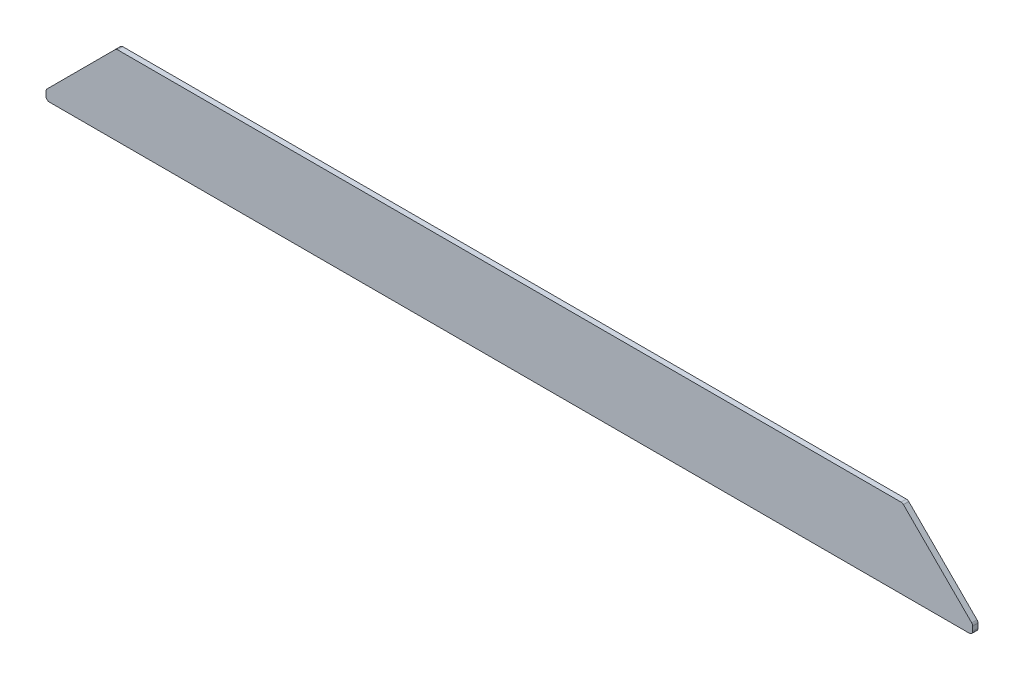
ISO-10303-21;
HEADER;
FILE_DESCRIPTION(('STEP AP214'),'2;1');
FILE_NAME('part.step','',(''),(''),'','','');
FILE_SCHEMA(('AUTOMOTIVE_DESIGN { 1 0 10303 214 1 1 1 1 }'));
ENDSEC;
DATA;
#1=APPLICATION_CONTEXT('core data for automotive mechanical design processes');
#2=APPLICATION_PROTOCOL_DEFINITION('international standard','automotive_design',2000,#1);
#3=PRODUCT_CONTEXT('',#1,'mechanical');
#4=PRODUCT('Part','Part','',(#3));
#5=PRODUCT_RELATED_PRODUCT_CATEGORY('part','',(#4));
#6=PRODUCT_DEFINITION_FORMATION('','',#4);
#7=PRODUCT_DEFINITION_CONTEXT('part definition',#1,'design');
#8=PRODUCT_DEFINITION('design','',#6,#7);
#9=PRODUCT_DEFINITION_SHAPE('','',#8);
#10=(LENGTH_UNIT() NAMED_UNIT(*) SI_UNIT(.MILLI.,.METRE.));
#11=(NAMED_UNIT(*) PLANE_ANGLE_UNIT() SI_UNIT($,.RADIAN.));
#12=(NAMED_UNIT(*) SI_UNIT($,.STERADIAN.) SOLID_ANGLE_UNIT());
#13=UNCERTAINTY_MEASURE_WITH_UNIT(LENGTH_MEASURE(1.E-05),#10,'distance_accuracy_value','');
#14=(GEOMETRIC_REPRESENTATION_CONTEXT(3) GLOBAL_UNCERTAINTY_ASSIGNED_CONTEXT((#13)) GLOBAL_UNIT_ASSIGNED_CONTEXT((#10,
#11,#12)) REPRESENTATION_CONTEXT('',''));
#15=CARTESIAN_POINT('',(0.,0.,0.));
#16=DIRECTION('',(0.,0.,1.));
#17=DIRECTION('',(1.,0.,0.));
#18=AXIS2_PLACEMENT_3D('',#15,#16,#17);
#19=CARTESIAN_POINT('',(280.,0.,1.6));
#20=DIRECTION('',(-1.,0.,0.));
#21=DIRECTION('',(0.,0.,1.));
#22=AXIS2_PLACEMENT_3D('',#19,#20,#21);
#23=PLANE('',#22);
#24=DIRECTION('',(0.,1.,0.));
#25=VECTOR('',#24,1.);
#26=CARTESIAN_POINT('',(280.,0.,1.6));
#27=LINE('',#26,#25);
#28=CARTESIAN_POINT('',(280.,1.,1.6));
#29=VERTEX_POINT('',#28);
#30=CARTESIAN_POINT('',(280.,2.37258300203055,1.6));
#31=VERTEX_POINT('',#30);
#32=EDGE_CURVE('E229',#29,#31,#27,.T.);
#33=ORIENTED_EDGE('',*,*,#32,.F.);
#34=DIRECTION('',(0.,0.,-1.));
#35=VECTOR('',#34,1.);
#36=CARTESIAN_POINT('',(280.,1.,1.6));
#37=LINE('',#36,#35);
#38=CARTESIAN_POINT('',(280.,1.,0.));
#39=VERTEX_POINT('',#38);
#40=EDGE_CURVE('E280',#29,#39,#37,.T.);
#41=ORIENTED_EDGE('',*,*,#40,.T.);
#42=DIRECTION('',(0.,1.,0.));
#43=VECTOR('',#42,1.);
#44=CARTESIAN_POINT('',(280.,0.,0.));
#45=LINE('',#44,#43);
#46=CARTESIAN_POINT('',(280.,2.37258300203055,0.));
#47=VERTEX_POINT('',#46);
#48=EDGE_CURVE('E218',#39,#47,#45,.T.);
#49=ORIENTED_EDGE('',*,*,#48,.T.);
#50=DIRECTION('',(0.,0.,-1.));
#51=VECTOR('',#50,1.);
#52=CARTESIAN_POINT('',(280.,2.37258300203055,1.6));
#53=LINE('',#52,#51);
#54=EDGE_CURVE('E255',#47,#31,#53,.F.);
#55=ORIENTED_EDGE('',*,*,#54,.T.);
#56=EDGE_LOOP('',(#33,#41,#49,#55));
#57=FACE_BOUND('',#56,.T.);
#58=ADVANCED_FACE('F44',(#57),#23,.F.);
#59=CARTESIAN_POINT('',(141.393398282201,141.393398282202,1.6));
#60=DIRECTION('',(-0.707106781186545,-0.70710678118655,0.));
#61=DIRECTION('',(0.70710678118655,-0.707106781186545,0.));
#62=AXIS2_PLACEMENT_3D('',#59,#60,#61);
#63=PLANE('',#62);
#64=DIRECTION('',(-0.70710678118655,0.707106781186545,0.));
#65=VECTOR('',#64,1.);
#66=CARTESIAN_POINT('',(141.393398282201,141.393398282202,0.));
#67=LINE('',#66,#65);
#68=CARTESIAN_POINT('',(279.707106781187,3.0796897832171,0.));
#69=VERTEX_POINT('',#68);
#70=CARTESIAN_POINT('',(259.079689783217,23.7071067811865,0.));
#71=VERTEX_POINT('',#70);
#72=EDGE_CURVE('E158',#69,#71,#67,.T.);
#73=ORIENTED_EDGE('',*,*,#72,.T.);
#74=DIRECTION('',(0.,0.,-1.));
#75=VECTOR('',#74,1.);
#76=CARTESIAN_POINT('',(259.079689783217,23.7071067811866,1.6));
#77=LINE('',#76,#75);
#78=CARTESIAN_POINT('',(259.079689783217,23.7071067811865,1.6));
#79=VERTEX_POINT('',#78);
#80=EDGE_CURVE('E191',#71,#79,#77,.F.);
#81=ORIENTED_EDGE('',*,*,#80,.T.);
#82=DIRECTION('',(-0.70710678118655,0.707106781186545,0.));
#83=VECTOR('',#82,1.);
#84=CARTESIAN_POINT('',(141.393398282201,141.393398282202,1.6));
#85=LINE('',#84,#83);
#86=CARTESIAN_POINT('',(279.707106781187,3.0796897832171,1.6));
#87=VERTEX_POINT('',#86);
#88=EDGE_CURVE('E234',#87,#79,#85,.T.);
#89=ORIENTED_EDGE('',*,*,#88,.F.);
#90=DIRECTION('',(0.,0.,-1.));
#91=VECTOR('',#90,1.);
#92=CARTESIAN_POINT('',(279.707106781187,3.07968978321713,1.6));
#93=LINE('',#92,#91);
#94=EDGE_CURVE('E187',#87,#69,#93,.T.);
#95=ORIENTED_EDGE('',*,*,#94,.T.);
#96=EDGE_LOOP('',(#73,#81,#89,#95));
#97=FACE_BOUND('',#96,.T.);
#98=ADVANCED_FACE('F269',(#97),#63,.F.);
#99=CARTESIAN_POINT('',(0.,24.,1.6));
#100=DIRECTION('',(0.,1.,0.));
#101=DIRECTION('',(0.,0.,1.));
#102=AXIS2_PLACEMENT_3D('',#99,#100,#101);
#103=PLANE('',#102);
#104=DIRECTION('',(1.,0.,0.));
#105=VECTOR('',#104,1.);
#106=CARTESIAN_POINT('',(0.,24.,1.6));
#107=LINE('',#106,#105);
#108=CARTESIAN_POINT('',(21.6274169979696,24.,1.6));
#109=VERTEX_POINT('',#108);
#110=CARTESIAN_POINT('',(258.37258300203,24.,1.6));
#111=VERTEX_POINT('',#110);
#112=EDGE_CURVE('E209',#109,#111,#107,.T.);
#113=ORIENTED_EDGE('',*,*,#112,.T.);
#114=DIRECTION('',(0.,0.,-1.));
#115=VECTOR('',#114,1.);
#116=CARTESIAN_POINT('',(258.37258300203,24.,0.));
#117=LINE('',#116,#115);
#118=CARTESIAN_POINT('',(258.37258300203,24.,0.));
#119=VERTEX_POINT('',#118);
#120=EDGE_CURVE('E148',#111,#119,#117,.T.);
#121=ORIENTED_EDGE('',*,*,#120,.T.);
#122=DIRECTION('',(1.,0.,0.));
#123=VECTOR('',#122,1.);
#124=CARTESIAN_POINT('',(0.,24.,0.));
#125=LINE('',#124,#123);
#126=CARTESIAN_POINT('',(21.6274169979696,24.,0.));
#127=VERTEX_POINT('',#126);
#128=EDGE_CURVE('E139',#127,#119,#125,.T.);
#129=ORIENTED_EDGE('',*,*,#128,.F.);
#130=DIRECTION('',(0.,0.,-1.));
#131=VECTOR('',#130,1.);
#132=CARTESIAN_POINT('',(21.6274169979696,24.,1.6));
#133=LINE('',#132,#131);
#134=EDGE_CURVE('E154',#127,#109,#133,.F.);
#135=ORIENTED_EDGE('',*,*,#134,.T.);
#136=EDGE_LOOP('',(#113,#121,#129,#135));
#137=FACE_BOUND('',#136,.T.);
#138=ADVANCED_FACE('F153',(#137),#103,.T.);
#139=CARTESIAN_POINT('',(-1.39339828220181,1.39339828220181,1.6));
#140=DIRECTION('',(-0.707106781186546,0.707106781186549,0.));
#141=DIRECTION('',(-0.707106781186549,-0.707106781186546,0.));
#142=AXIS2_PLACEMENT_3D('',#139,#140,#141);
#143=PLANE('',#142);
#144=DIRECTION('',(0.707106781186549,0.707106781186546,0.));
#145=VECTOR('',#144,1.);
#146=CARTESIAN_POINT('',(-1.39339828220181,1.39339828220181,0.));
#147=LINE('',#146,#145);
#148=CARTESIAN_POINT('',(0.292893218813454,3.07968978321706,0.));
#149=VERTEX_POINT('',#148);
#150=CARTESIAN_POINT('',(20.920310216783,23.7071067811866,0.));
#151=VERTEX_POINT('',#150);
#152=EDGE_CURVE('E141',#149,#151,#147,.T.);
#153=ORIENTED_EDGE('',*,*,#152,.F.);
#154=DIRECTION('',(0.,0.,-1.));
#155=VECTOR('',#154,1.);
#156=CARTESIAN_POINT('',(0.292893218813454,3.07968978321706,1.6));
#157=LINE('',#156,#155);
#158=CARTESIAN_POINT('',(0.292893218813454,3.07968978321706,1.6));
#159=VERTEX_POINT('',#158);
#160=EDGE_CURVE('E53',#149,#159,#157,.F.);
#161=ORIENTED_EDGE('',*,*,#160,.T.);
#162=DIRECTION('',(0.707106781186549,0.707106781186546,0.));
#163=VECTOR('',#162,1.);
#164=CARTESIAN_POINT('',(-1.39339828220181,1.39339828220181,1.6));
#165=LINE('',#164,#163);
#166=CARTESIAN_POINT('',(20.920310216783,23.7071067811866,1.6));
#167=VERTEX_POINT('',#166);
#168=EDGE_CURVE('E168',#159,#167,#165,.T.);
#169=ORIENTED_EDGE('',*,*,#168,.T.);
#170=DIRECTION('',(0.,0.,-1.));
#171=VECTOR('',#170,1.);
#172=CARTESIAN_POINT('',(20.920310216783,23.7071067811865,1.6));
#173=LINE('',#172,#171);
#174=EDGE_CURVE('E295',#167,#151,#173,.T.);
#175=ORIENTED_EDGE('',*,*,#174,.T.);
#176=EDGE_LOOP('',(#153,#161,#169,#175));
#177=FACE_BOUND('',#176,.T.);
#178=ADVANCED_FACE('F300',(#177),#143,.T.);
#179=CARTESIAN_POINT('',(0.,0.,1.6));
#180=DIRECTION('',(-1.,0.,0.));
#181=DIRECTION('',(0.,0.,1.));
#182=AXIS2_PLACEMENT_3D('',#179,#180,#181);
#183=PLANE('',#182);
#184=DIRECTION('',(0.,1.,0.));
#185=VECTOR('',#184,1.);
#186=CARTESIAN_POINT('',(0.,0.,1.6));
#187=LINE('',#186,#185);
#188=CARTESIAN_POINT('',(0.,1.,1.6));
#189=VERTEX_POINT('',#188);
#190=CARTESIAN_POINT('',(0.,2.37258300203052,1.6));
#191=VERTEX_POINT('',#190);
#192=EDGE_CURVE('E163',#189,#191,#187,.T.);
#193=ORIENTED_EDGE('',*,*,#192,.T.);
#194=DIRECTION('',(0.,0.,-1.));
#195=VECTOR('',#194,1.);
#196=CARTESIAN_POINT('',(0.,2.37258300203052,1.6));
#197=LINE('',#196,#195);
#198=CARTESIAN_POINT('',(0.,2.37258300203052,0.));
#199=VERTEX_POINT('',#198);
#200=EDGE_CURVE('E291',#191,#199,#197,.T.);
#201=ORIENTED_EDGE('',*,*,#200,.T.);
#202=DIRECTION('',(0.,1.,0.));
#203=VECTOR('',#202,1.);
#204=CARTESIAN_POINT('',(0.,0.,0.));
#205=LINE('',#204,#203);
#206=CARTESIAN_POINT('',(0.,1.,0.));
#207=VERTEX_POINT('',#206);
#208=EDGE_CURVE('E170',#207,#199,#205,.T.);
#209=ORIENTED_EDGE('',*,*,#208,.F.);
#210=DIRECTION('',(0.,0.,-1.));
#211=VECTOR('',#210,1.);
#212=CARTESIAN_POINT('',(0.,1.,1.6));
#213=LINE('',#212,#211);
#214=EDGE_CURVE('E286',#207,#189,#213,.F.);
#215=ORIENTED_EDGE('',*,*,#214,.T.);
#216=EDGE_LOOP('',(#193,#201,#209,#215));
#217=FACE_BOUND('',#216,.T.);
#218=ADVANCED_FACE('F337',(#217),#183,.T.);
#219=CARTESIAN_POINT('',(0.,0.,1.6));
#220=DIRECTION('',(0.,1.,0.));
#221=DIRECTION('',(0.,0.,1.));
#222=AXIS2_PLACEMENT_3D('',#219,#220,#221);
#223=PLANE('',#222);
#224=DIRECTION('',(1.,0.,0.));
#225=VECTOR('',#224,1.);
#226=CARTESIAN_POINT('',(0.,0.,1.6));
#227=LINE('',#226,#225);
#228=CARTESIAN_POINT('',(1.,0.,1.6));
#229=VERTEX_POINT('',#228);
#230=CARTESIAN_POINT('',(279.,0.,1.6));
#231=VERTEX_POINT('',#230);
#232=EDGE_CURVE('E59',#229,#231,#227,.T.);
#233=ORIENTED_EDGE('',*,*,#232,.F.);
#234=DIRECTION('',(0.,0.,-1.));
#235=VECTOR('',#234,1.);
#236=CARTESIAN_POINT('',(1.,0.,0.));
#237=LINE('',#236,#235);
#238=CARTESIAN_POINT('',(1.,0.,0.));
#239=VERTEX_POINT('',#238);
#240=EDGE_CURVE('E12',#229,#239,#237,.T.);
#241=ORIENTED_EDGE('',*,*,#240,.T.);
#242=DIRECTION('',(1.,0.,0.));
#243=VECTOR('',#242,1.);
#244=CARTESIAN_POINT('',(0.,0.,0.));
#245=LINE('',#244,#243);
#246=CARTESIAN_POINT('',(279.,0.,0.));
#247=VERTEX_POINT('',#246);
#248=EDGE_CURVE('E214',#239,#247,#245,.T.);
#249=ORIENTED_EDGE('',*,*,#248,.T.);
#250=DIRECTION('',(0.,0.,-1.));
#251=VECTOR('',#250,1.);
#252=CARTESIAN_POINT('',(279.,0.,1.6));
#253=LINE('',#252,#251);
#254=EDGE_CURVE('E283',#247,#231,#253,.F.);
#255=ORIENTED_EDGE('',*,*,#254,.T.);
#256=EDGE_LOOP('',(#233,#241,#249,#255));
#257=FACE_BOUND('',#256,.T.);
#258=ADVANCED_FACE('F315',(#257),#223,.F.);
#259=CARTESIAN_POINT('',(0.,0.,1.6));
#260=DIRECTION('',(0.,0.,1.));
#261=DIRECTION('',(1.,0.,0.));
#262=AXIS2_PLACEMENT_3D('',#259,#260,#261);
#263=PLANE('',#262);
#264=CARTESIAN_POINT('',(1.,1.,1.6));
#265=DIRECTION('',(0.,0.,1.));
#266=DIRECTION('',(1.,0.,0.));
#267=AXIS2_PLACEMENT_3D('',#264,#265,#266);
#268=CIRCLE('',#267,1.);
#269=EDGE_CURVE('E197',#189,#229,#268,.T.);
#270=ORIENTED_EDGE('',*,*,#269,.T.);
#271=ORIENTED_EDGE('',*,*,#232,.T.);
#272=CARTESIAN_POINT('',(279.,1.,1.6));
#273=DIRECTION('',(0.,0.,1.));
#274=DIRECTION('',(1.,0.,0.));
#275=AXIS2_PLACEMENT_3D('',#272,#273,#274);
#276=CIRCLE('',#275,1.);
#277=EDGE_CURVE('E244',#231,#29,#276,.T.);
#278=ORIENTED_EDGE('',*,*,#277,.T.);
#279=ORIENTED_EDGE('',*,*,#32,.T.);
#280=CARTESIAN_POINT('',(279.,2.37258300203055,1.6));
#281=DIRECTION('',(0.,0.,1.));
#282=DIRECTION('',(1.,0.,0.));
#283=AXIS2_PLACEMENT_3D('',#280,#281,#282);
#284=CIRCLE('',#283,1.);
#285=EDGE_CURVE('E250',#31,#87,#284,.T.);
#286=ORIENTED_EDGE('',*,*,#285,.T.);
#287=ORIENTED_EDGE('',*,*,#88,.T.);
#288=CARTESIAN_POINT('',(258.37258300203,23.,1.6));
#289=DIRECTION('',(0.,0.,1.));
#290=DIRECTION('',(1.,0.,0.));
#291=AXIS2_PLACEMENT_3D('',#288,#289,#290);
#292=CIRCLE('',#291,1.);
#293=EDGE_CURVE('E249',#79,#111,#292,.T.);
#294=ORIENTED_EDGE('',*,*,#293,.T.);
#295=ORIENTED_EDGE('',*,*,#112,.F.);
#296=CARTESIAN_POINT('',(21.6274169979696,23.,1.6));
#297=DIRECTION('',(0.,0.,1.));
#298=DIRECTION('',(1.,0.,0.));
#299=AXIS2_PLACEMENT_3D('',#296,#297,#298);
#300=CIRCLE('',#299,1.);
#301=EDGE_CURVE('E161',#109,#167,#300,.T.);
#302=ORIENTED_EDGE('',*,*,#301,.T.);
#303=ORIENTED_EDGE('',*,*,#168,.F.);
#304=CARTESIAN_POINT('',(1.,2.37258300203052,1.6));
#305=DIRECTION('',(0.,0.,1.));
#306=DIRECTION('',(1.,0.,0.));
#307=AXIS2_PLACEMENT_3D('',#304,#305,#306);
#308=CIRCLE('',#307,1.);
#309=EDGE_CURVE('E67',#159,#191,#308,.T.);
#310=ORIENTED_EDGE('',*,*,#309,.T.);
#311=ORIENTED_EDGE('',*,*,#192,.F.);
#312=EDGE_LOOP('',(#270,#271,#278,#279,#286,#287,#294,#295,#302,#303,#310,#311));
#313=FACE_BOUND('',#312,.T.);
#314=ADVANCED_FACE('F302',(#313),#263,.T.);
#315=CARTESIAN_POINT('',(0.,0.,0.));
#316=DIRECTION('',(0.,0.,1.));
#317=DIRECTION('',(1.,0.,0.));
#318=AXIS2_PLACEMENT_3D('',#315,#316,#317);
#319=PLANE('',#318);
#320=ORIENTED_EDGE('',*,*,#248,.F.);
#321=CARTESIAN_POINT('',(1.,1.,0.));
#322=DIRECTION('',(0.,0.,1.));
#323=DIRECTION('',(1.,0.,0.));
#324=AXIS2_PLACEMENT_3D('',#321,#322,#323);
#325=CIRCLE('',#324,1.);
#326=EDGE_CURVE('E147',#239,#207,#325,.F.);
#327=ORIENTED_EDGE('',*,*,#326,.T.);
#328=ORIENTED_EDGE('',*,*,#208,.T.);
#329=CARTESIAN_POINT('',(1.,2.37258300203052,0.));
#330=DIRECTION('',(0.,0.,1.));
#331=DIRECTION('',(1.,0.,0.));
#332=AXIS2_PLACEMENT_3D('',#329,#330,#331);
#333=CIRCLE('',#332,1.);
#334=EDGE_CURVE('E175',#199,#149,#333,.F.);
#335=ORIENTED_EDGE('',*,*,#334,.T.);
#336=ORIENTED_EDGE('',*,*,#152,.T.);
#337=CARTESIAN_POINT('',(21.6274169979696,23.,0.));
#338=DIRECTION('',(0.,0.,1.));
#339=DIRECTION('',(1.,0.,0.));
#340=AXIS2_PLACEMENT_3D('',#337,#338,#339);
#341=CIRCLE('',#340,1.);
#342=EDGE_CURVE('E136',#151,#127,#341,.F.);
#343=ORIENTED_EDGE('',*,*,#342,.T.);
#344=ORIENTED_EDGE('',*,*,#128,.T.);
#345=CARTESIAN_POINT('',(258.37258300203,23.,0.));
#346=DIRECTION('',(0.,0.,1.));
#347=DIRECTION('',(1.,0.,0.));
#348=AXIS2_PLACEMENT_3D('',#345,#346,#347);
#349=CIRCLE('',#348,1.);
#350=EDGE_CURVE('E184',#119,#71,#349,.F.);
#351=ORIENTED_EDGE('',*,*,#350,.T.);
#352=ORIENTED_EDGE('',*,*,#72,.F.);
#353=CARTESIAN_POINT('',(279.,2.37258300203055,0.));
#354=DIRECTION('',(0.,0.,1.));
#355=DIRECTION('',(1.,0.,0.));
#356=AXIS2_PLACEMENT_3D('',#353,#354,#355);
#357=CIRCLE('',#356,1.);
#358=EDGE_CURVE('E178',#69,#47,#357,.F.);
#359=ORIENTED_EDGE('',*,*,#358,.T.);
#360=ORIENTED_EDGE('',*,*,#48,.F.);
#361=CARTESIAN_POINT('',(279.,1.,0.));
#362=DIRECTION('',(0.,0.,1.));
#363=DIRECTION('',(1.,0.,0.));
#364=AXIS2_PLACEMENT_3D('',#361,#362,#363);
#365=CIRCLE('',#364,1.);
#366=EDGE_CURVE('E181',#39,#247,#365,.F.);
#367=ORIENTED_EDGE('',*,*,#366,.T.);
#368=EDGE_LOOP('',(#320,#327,#328,#335,#336,#343,#344,#351,#352,#359,#360,#367));
#369=FACE_BOUND('',#368,.T.);
#370=ADVANCED_FACE('F138',(#369),#319,.F.);
#371=CARTESIAN_POINT('',(258.37258300203,23.,1.6));
#372=DIRECTION('',(0.,0.,1.));
#373=DIRECTION('',(1.,0.,0.));
#374=AXIS2_PLACEMENT_3D('',#371,#372,#373);
#375=CYLINDRICAL_SURFACE('',#374,1.);
#376=ORIENTED_EDGE('',*,*,#293,.F.);
#377=ORIENTED_EDGE('',*,*,#80,.F.);
#378=ORIENTED_EDGE('',*,*,#350,.F.);
#379=ORIENTED_EDGE('',*,*,#120,.F.);
#380=EDGE_LOOP('',(#376,#377,#378,#379));
#381=FACE_BOUND('',#380,.T.);
#382=ADVANCED_FACE('F265',(#381),#375,.T.);
#383=CARTESIAN_POINT('',(279.,1.,1.6));
#384=DIRECTION('',(0.,0.,-1.));
#385=DIRECTION('',(-1.,0.,0.));
#386=AXIS2_PLACEMENT_3D('',#383,#384,#385);
#387=CYLINDRICAL_SURFACE('',#386,1.);
#388=ORIENTED_EDGE('',*,*,#277,.F.);
#389=ORIENTED_EDGE('',*,*,#254,.F.);
#390=ORIENTED_EDGE('',*,*,#366,.F.);
#391=ORIENTED_EDGE('',*,*,#40,.F.);
#392=EDGE_LOOP('',(#388,#389,#390,#391));
#393=FACE_BOUND('',#392,.T.);
#394=ADVANCED_FACE('F317',(#393),#387,.T.);
#395=CARTESIAN_POINT('',(279.,2.37258300203055,1.6));
#396=DIRECTION('',(0.,0.,-1.));
#397=DIRECTION('',(-1.,0.,0.));
#398=AXIS2_PLACEMENT_3D('',#395,#396,#397);
#399=CYLINDRICAL_SURFACE('',#398,1.);
#400=ORIENTED_EDGE('',*,*,#285,.F.);
#401=ORIENTED_EDGE('',*,*,#54,.F.);
#402=ORIENTED_EDGE('',*,*,#358,.F.);
#403=ORIENTED_EDGE('',*,*,#94,.F.);
#404=EDGE_LOOP('',(#400,#401,#402,#403));
#405=FACE_BOUND('',#404,.T.);
#406=ADVANCED_FACE('F273',(#405),#399,.T.);
#407=CARTESIAN_POINT('',(1.,2.37258300203052,1.6));
#408=DIRECTION('',(0.,0.,-1.));
#409=DIRECTION('',(-1.,0.,0.));
#410=AXIS2_PLACEMENT_3D('',#407,#408,#409);
#411=CYLINDRICAL_SURFACE('',#410,1.);
#412=ORIENTED_EDGE('',*,*,#309,.F.);
#413=ORIENTED_EDGE('',*,*,#160,.F.);
#414=ORIENTED_EDGE('',*,*,#334,.F.);
#415=ORIENTED_EDGE('',*,*,#200,.F.);
#416=EDGE_LOOP('',(#412,#413,#414,#415));
#417=FACE_BOUND('',#416,.T.);
#418=ADVANCED_FACE('F304',(#417),#411,.T.);
#419=CARTESIAN_POINT('',(1.,1.,1.6));
#420=DIRECTION('',(0.,0.,1.));
#421=DIRECTION('',(1.,0.,0.));
#422=AXIS2_PLACEMENT_3D('',#419,#420,#421);
#423=CYLINDRICAL_SURFACE('',#422,1.);
#424=ORIENTED_EDGE('',*,*,#269,.F.);
#425=ORIENTED_EDGE('',*,*,#214,.F.);
#426=ORIENTED_EDGE('',*,*,#326,.F.);
#427=ORIENTED_EDGE('',*,*,#240,.F.);
#428=EDGE_LOOP('',(#424,#425,#426,#427));
#429=FACE_BOUND('',#428,.T.);
#430=ADVANCED_FACE('F314',(#429),#423,.T.);
#431=CARTESIAN_POINT('',(21.6274169979696,23.,1.6));
#432=DIRECTION('',(0.,0.,-1.));
#433=DIRECTION('',(-1.,0.,0.));
#434=AXIS2_PLACEMENT_3D('',#431,#432,#433);
#435=CYLINDRICAL_SURFACE('',#434,1.);
#436=ORIENTED_EDGE('',*,*,#301,.F.);
#437=ORIENTED_EDGE('',*,*,#134,.F.);
#438=ORIENTED_EDGE('',*,*,#342,.F.);
#439=ORIENTED_EDGE('',*,*,#174,.F.);
#440=EDGE_LOOP('',(#436,#437,#438,#439));
#441=FACE_BOUND('',#440,.T.);
#442=ADVANCED_FACE('F46',(#441),#435,.T.);
#443=CLOSED_SHELL('',(#58,#98,#138,#178,#218,#258,#314,#370,#382,#394,#406,#418,#430,#442));
#444=MANIFOLD_SOLID_BREP('B2',#443);
#445=ADVANCED_BREP_SHAPE_REPRESENTATION('',(#18,#444),#14);
#446=SHAPE_DEFINITION_REPRESENTATION(#9,#445);
ENDSEC;
END-ISO-10303-21;
